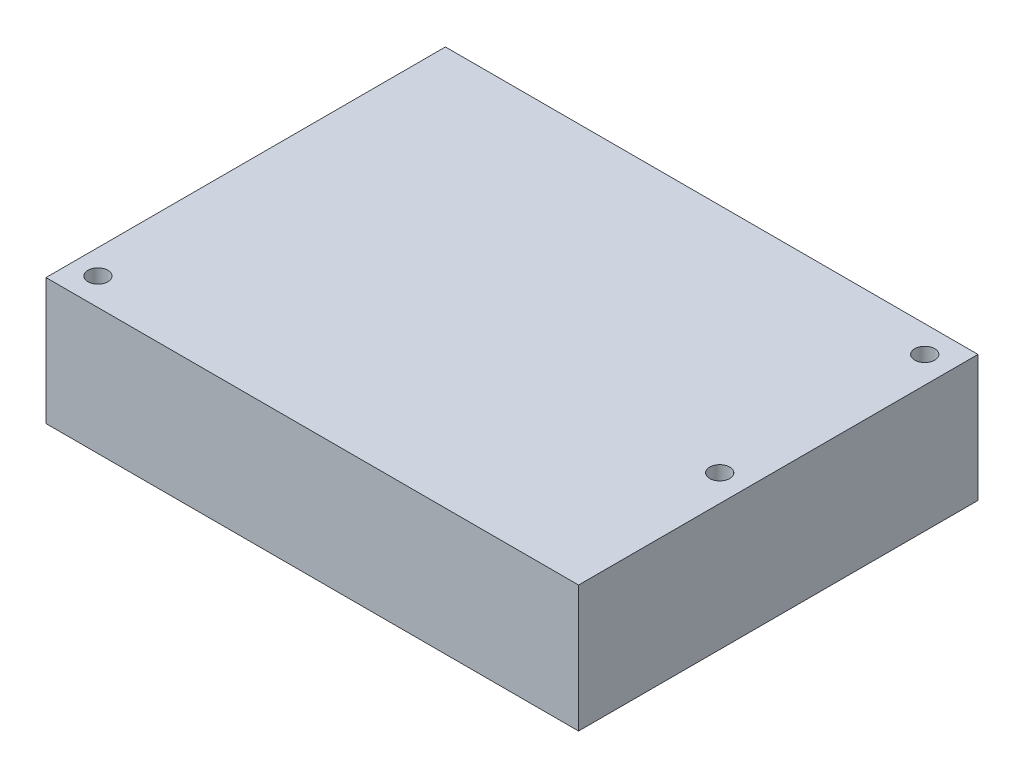
ISO-10303-21;
HEADER;
FILE_DESCRIPTION(('STEP AP214'),'2;1');
FILE_NAME('part.step','',(''),(''),'','','');
FILE_SCHEMA(('AUTOMOTIVE_DESIGN { 1 0 10303 214 1 1 1 1 }'));
ENDSEC;
DATA;
#1=APPLICATION_CONTEXT('core data for automotive mechanical design processes');
#2=APPLICATION_PROTOCOL_DEFINITION('international standard','automotive_design',2000,#1);
#3=PRODUCT_CONTEXT('',#1,'mechanical');
#4=PRODUCT('Part','Part','',(#3));
#5=PRODUCT_RELATED_PRODUCT_CATEGORY('part','',(#4));
#6=PRODUCT_DEFINITION_FORMATION('','',#4);
#7=PRODUCT_DEFINITION_CONTEXT('part definition',#1,'design');
#8=PRODUCT_DEFINITION('design','',#6,#7);
#9=PRODUCT_DEFINITION_SHAPE('','',#8);
#10=(LENGTH_UNIT() NAMED_UNIT(*) SI_UNIT(.MILLI.,.METRE.));
#11=(NAMED_UNIT(*) PLANE_ANGLE_UNIT() SI_UNIT($,.RADIAN.));
#12=(NAMED_UNIT(*) SI_UNIT($,.STERADIAN.) SOLID_ANGLE_UNIT());
#13=UNCERTAINTY_MEASURE_WITH_UNIT(LENGTH_MEASURE(1.E-05),#10,'distance_accuracy_value','');
#14=(GEOMETRIC_REPRESENTATION_CONTEXT(3) GLOBAL_UNCERTAINTY_ASSIGNED_CONTEXT((#13)) GLOBAL_UNIT_ASSIGNED_CONTEXT((#10,
#11,#12)) REPRESENTATION_CONTEXT('',''));
#15=CARTESIAN_POINT('',(0.,0.,0.));
#16=DIRECTION('',(0.,0.,1.));
#17=DIRECTION('',(1.,0.,0.));
#18=AXIS2_PLACEMENT_3D('',#15,#16,#17);
#19=CARTESIAN_POINT('',(0.,19.,0.));
#20=DIRECTION('',(0.,-1.,0.));
#21=DIRECTION('',(0.,0.,-1.));
#22=AXIS2_PLACEMENT_3D('',#19,#20,#21);
#23=PLANE('',#22);
#24=CARTESIAN_POINT('',(36.,19.,4.8));
#25=DIRECTION('',(0.,1.,0.));
#26=DIRECTION('',(0.,0.,1.));
#27=AXIS2_PLACEMENT_3D('',#24,#25,#26);
#28=CIRCLE('',#27,1.5);
#29=CARTESIAN_POINT('',(36.,19.,6.30000000000001));
#30=VERTEX_POINT('',#29);
#31=EDGE_CURVE('E115',#30,#30,#28,.T.);
#32=ORIENTED_EDGE('',*,*,#31,.F.);
#33=EDGE_LOOP('',(#32));
#34=FACE_BOUND('',#33,.T.);
#35=DIRECTION('',(0.,0.,-1.));
#36=VECTOR('',#35,1.);
#37=CARTESIAN_POINT('',(40.,19.,30.));
#38=LINE('',#37,#36);
#39=CARTESIAN_POINT('',(40.,19.,30.));
#40=VERTEX_POINT('',#39);
#41=CARTESIAN_POINT('',(40.,19.,-30.));
#42=VERTEX_POINT('',#41);
#43=EDGE_CURVE('E85',#40,#42,#38,.T.);
#44=ORIENTED_EDGE('',*,*,#43,.T.);
#45=DIRECTION('',(-1.,0.,0.));
#46=VECTOR('',#45,1.);
#47=CARTESIAN_POINT('',(-40.,19.,-30.));
#48=LINE('',#47,#46);
#49=CARTESIAN_POINT('',(-40.,19.,-30.));
#50=VERTEX_POINT('',#49);
#51=EDGE_CURVE('E80',#42,#50,#48,.T.);
#52=ORIENTED_EDGE('',*,*,#51,.T.);
#53=DIRECTION('',(0.,0.,1.));
#54=VECTOR('',#53,1.);
#55=CARTESIAN_POINT('',(-40.,19.,30.));
#56=LINE('',#55,#54);
#57=CARTESIAN_POINT('',(-40.,19.,30.));
#58=VERTEX_POINT('',#57);
#59=EDGE_CURVE('E83',#50,#58,#56,.T.);
#60=ORIENTED_EDGE('',*,*,#59,.T.);
#61=DIRECTION('',(1.,0.,0.));
#62=VECTOR('',#61,1.);
#63=CARTESIAN_POINT('',(-40.,19.,30.));
#64=LINE('',#63,#62);
#65=EDGE_CURVE('E50',#58,#40,#64,.T.);
#66=ORIENTED_EDGE('',*,*,#65,.T.);
#67=EDGE_LOOP('',(#44,#52,#60,#66));
#68=FACE_BOUND('',#67,.T.);
#69=CARTESIAN_POINT('',(36.,19.,-26.));
#70=DIRECTION('',(0.,1.,0.));
#71=DIRECTION('',(0.,0.,1.));
#72=AXIS2_PLACEMENT_3D('',#69,#70,#71);
#73=CIRCLE('',#72,1.5);
#74=CARTESIAN_POINT('',(36.,19.,-24.5));
#75=VERTEX_POINT('',#74);
#76=EDGE_CURVE('E100',#75,#75,#73,.T.);
#77=ORIENTED_EDGE('',*,*,#76,.F.);
#78=EDGE_LOOP('',(#77));
#79=FACE_BOUND('',#78,.T.);
#80=CARTESIAN_POINT('',(-36.3,19.,25.9));
#81=DIRECTION('',(0.,1.,0.));
#82=DIRECTION('',(0.,0.,1.));
#83=AXIS2_PLACEMENT_3D('',#80,#81,#82);
#84=CIRCLE('',#83,1.5);
#85=CARTESIAN_POINT('',(-36.3,19.,27.4));
#86=VERTEX_POINT('',#85);
#87=EDGE_CURVE('E121',#86,#86,#84,.T.);
#88=ORIENTED_EDGE('',*,*,#87,.F.);
#89=EDGE_LOOP('',(#88));
#90=FACE_BOUND('',#89,.T.);
#91=ADVANCED_FACE('F33',(#34,#68,#79,#90),#23,.F.);
#92=CARTESIAN_POINT('',(0.,0.,0.));
#93=DIRECTION('',(0.,-1.,0.));
#94=DIRECTION('',(0.,0.,-1.));
#95=AXIS2_PLACEMENT_3D('',#92,#93,#94);
#96=PLANE('',#95);
#97=CARTESIAN_POINT('',(36.,0.,4.8));
#98=DIRECTION('',(0.,1.,0.));
#99=DIRECTION('',(0.,0.,1.));
#100=AXIS2_PLACEMENT_3D('',#97,#98,#99);
#101=CIRCLE('',#100,1.5);
#102=CARTESIAN_POINT('',(36.,0.,6.30000000000001));
#103=VERTEX_POINT('',#102);
#104=EDGE_CURVE('E118',#103,#103,#101,.T.);
#105=ORIENTED_EDGE('',*,*,#104,.T.);
#106=EDGE_LOOP('',(#105));
#107=FACE_BOUND('',#106,.T.);
#108=DIRECTION('',(0.,0.,-1.));
#109=VECTOR('',#108,1.);
#110=CARTESIAN_POINT('',(40.,0.,30.));
#111=LINE('',#110,#109);
#112=CARTESIAN_POINT('',(40.,0.,30.));
#113=VERTEX_POINT('',#112);
#114=CARTESIAN_POINT('',(40.,0.,-30.));
#115=VERTEX_POINT('',#114);
#116=EDGE_CURVE('E97',#113,#115,#111,.T.);
#117=ORIENTED_EDGE('',*,*,#116,.F.);
#118=DIRECTION('',(1.,0.,0.));
#119=VECTOR('',#118,1.);
#120=CARTESIAN_POINT('',(-40.,0.,30.));
#121=LINE('',#120,#119);
#122=CARTESIAN_POINT('',(-40.,0.,30.));
#123=VERTEX_POINT('',#122);
#124=EDGE_CURVE('E73',#123,#113,#121,.T.);
#125=ORIENTED_EDGE('',*,*,#124,.F.);
#126=DIRECTION('',(0.,0.,1.));
#127=VECTOR('',#126,1.);
#128=CARTESIAN_POINT('',(-40.,0.,30.));
#129=LINE('',#128,#127);
#130=CARTESIAN_POINT('',(-40.,0.,-30.));
#131=VERTEX_POINT('',#130);
#132=EDGE_CURVE('E67',#131,#123,#129,.T.);
#133=ORIENTED_EDGE('',*,*,#132,.F.);
#134=DIRECTION('',(-1.,0.,0.));
#135=VECTOR('',#134,1.);
#136=CARTESIAN_POINT('',(-40.,0.,-30.));
#137=LINE('',#136,#135);
#138=EDGE_CURVE('E89',#115,#131,#137,.T.);
#139=ORIENTED_EDGE('',*,*,#138,.F.);
#140=EDGE_LOOP('',(#117,#125,#133,#139));
#141=FACE_BOUND('',#140,.T.);
#142=CARTESIAN_POINT('',(36.,0.,-26.));
#143=DIRECTION('',(0.,1.,0.));
#144=DIRECTION('',(0.,0.,1.));
#145=AXIS2_PLACEMENT_3D('',#142,#143,#144);
#146=CIRCLE('',#145,1.5);
#147=CARTESIAN_POINT('',(36.,0.,-24.5));
#148=VERTEX_POINT('',#147);
#149=EDGE_CURVE('E112',#148,#148,#146,.T.);
#150=ORIENTED_EDGE('',*,*,#149,.T.);
#151=EDGE_LOOP('',(#150));
#152=FACE_BOUND('',#151,.T.);
#153=CARTESIAN_POINT('',(-36.3,0.,25.9));
#154=DIRECTION('',(0.,1.,0.));
#155=DIRECTION('',(0.,0.,1.));
#156=AXIS2_PLACEMENT_3D('',#153,#154,#155);
#157=CIRCLE('',#156,1.5);
#158=CARTESIAN_POINT('',(-36.3,0.,27.4));
#159=VERTEX_POINT('',#158);
#160=EDGE_CURVE('E124',#159,#159,#157,.T.);
#161=ORIENTED_EDGE('',*,*,#160,.T.);
#162=EDGE_LOOP('',(#161));
#163=FACE_BOUND('',#162,.T.);
#164=ADVANCED_FACE('F108',(#107,#141,#152,#163),#96,.T.);
#165=CARTESIAN_POINT('',(40.,19.,30.));
#166=DIRECTION('',(-1.,0.,0.));
#167=DIRECTION('',(0.,0.,1.));
#168=AXIS2_PLACEMENT_3D('',#165,#166,#167);
#169=PLANE('',#168);
#170=ORIENTED_EDGE('',*,*,#116,.T.);
#171=DIRECTION('',(0.,-1.,0.));
#172=VECTOR('',#171,1.);
#173=CARTESIAN_POINT('',(40.,19.,-30.));
#174=LINE('',#173,#172);
#175=EDGE_CURVE('E11',#42,#115,#174,.T.);
#176=ORIENTED_EDGE('',*,*,#175,.F.);
#177=ORIENTED_EDGE('',*,*,#43,.F.);
#178=DIRECTION('',(0.,-1.,0.));
#179=VECTOR('',#178,1.);
#180=CARTESIAN_POINT('',(40.,19.,30.));
#181=LINE('',#180,#179);
#182=EDGE_CURVE('E93',#40,#113,#181,.T.);
#183=ORIENTED_EDGE('',*,*,#182,.T.);
#184=EDGE_LOOP('',(#170,#176,#177,#183));
#185=FACE_BOUND('',#184,.T.);
#186=ADVANCED_FACE('F35',(#185),#169,.F.);
#187=CARTESIAN_POINT('',(-40.,19.,-30.));
#188=DIRECTION('',(0.,0.,1.));
#189=DIRECTION('',(1.,0.,0.));
#190=AXIS2_PLACEMENT_3D('',#187,#188,#189);
#191=PLANE('',#190);
#192=ORIENTED_EDGE('',*,*,#138,.T.);
#193=DIRECTION('',(0.,-1.,0.));
#194=VECTOR('',#193,1.);
#195=CARTESIAN_POINT('',(-40.,19.,-30.));
#196=LINE('',#195,#194);
#197=EDGE_CURVE('E42',#50,#131,#196,.T.);
#198=ORIENTED_EDGE('',*,*,#197,.F.);
#199=ORIENTED_EDGE('',*,*,#51,.F.);
#200=ORIENTED_EDGE('',*,*,#175,.T.);
#201=EDGE_LOOP('',(#192,#198,#199,#200));
#202=FACE_BOUND('',#201,.T.);
#203=ADVANCED_FACE('F88',(#202),#191,.F.);
#204=CARTESIAN_POINT('',(-40.,19.,30.));
#205=DIRECTION('',(1.,0.,0.));
#206=DIRECTION('',(0.,0.,-1.));
#207=AXIS2_PLACEMENT_3D('',#204,#205,#206);
#208=PLANE('',#207);
#209=ORIENTED_EDGE('',*,*,#132,.T.);
#210=DIRECTION('',(0.,-1.,0.));
#211=VECTOR('',#210,1.);
#212=CARTESIAN_POINT('',(-40.,19.,30.));
#213=LINE('',#212,#211);
#214=EDGE_CURVE('E90',#58,#123,#213,.T.);
#215=ORIENTED_EDGE('',*,*,#214,.F.);
#216=ORIENTED_EDGE('',*,*,#59,.F.);
#217=ORIENTED_EDGE('',*,*,#197,.T.);
#218=EDGE_LOOP('',(#209,#215,#216,#217));
#219=FACE_BOUND('',#218,.T.);
#220=ADVANCED_FACE('F91',(#219),#208,.F.);
#221=CARTESIAN_POINT('',(-40.,19.,30.));
#222=DIRECTION('',(0.,0.,-1.));
#223=DIRECTION('',(-1.,0.,0.));
#224=AXIS2_PLACEMENT_3D('',#221,#222,#223);
#225=PLANE('',#224);
#226=ORIENTED_EDGE('',*,*,#124,.T.);
#227=ORIENTED_EDGE('',*,*,#182,.F.);
#228=ORIENTED_EDGE('',*,*,#65,.F.);
#229=ORIENTED_EDGE('',*,*,#214,.T.);
#230=EDGE_LOOP('',(#226,#227,#228,#229));
#231=FACE_BOUND('',#230,.T.);
#232=ADVANCED_FACE('F105',(#231),#225,.F.);
#233=CARTESIAN_POINT('',(36.,19.,-26.));
#234=DIRECTION('',(0.,-1.,0.));
#235=DIRECTION('',(0.,0.,-1.));
#236=AXIS2_PLACEMENT_3D('',#233,#234,#235);
#237=CYLINDRICAL_SURFACE('',#236,1.5);
#238=ORIENTED_EDGE('',*,*,#76,.T.);
#239=EDGE_LOOP('',(#238));
#240=FACE_BOUND('',#239,.T.);
#241=ORIENTED_EDGE('',*,*,#149,.F.);
#242=EDGE_LOOP('',(#241));
#243=FACE_BOUND('',#242,.T.);
#244=ADVANCED_FACE('F143',(#240,#243),#237,.F.);
#245=CARTESIAN_POINT('',(36.,19.,4.8));
#246=DIRECTION('',(0.,-1.,0.));
#247=DIRECTION('',(0.,0.,-1.));
#248=AXIS2_PLACEMENT_3D('',#245,#246,#247);
#249=CYLINDRICAL_SURFACE('',#248,1.5);
#250=ORIENTED_EDGE('',*,*,#31,.T.);
#251=EDGE_LOOP('',(#250));
#252=FACE_BOUND('',#251,.T.);
#253=ORIENTED_EDGE('',*,*,#104,.F.);
#254=EDGE_LOOP('',(#253));
#255=FACE_BOUND('',#254,.T.);
#256=ADVANCED_FACE('F189',(#252,#255),#249,.F.);
#257=CARTESIAN_POINT('',(-36.3,19.,25.9));
#258=DIRECTION('',(0.,-1.,0.));
#259=DIRECTION('',(0.,0.,-1.));
#260=AXIS2_PLACEMENT_3D('',#257,#258,#259);
#261=CYLINDRICAL_SURFACE('',#260,1.5);
#262=ORIENTED_EDGE('',*,*,#87,.T.);
#263=EDGE_LOOP('',(#262));
#264=FACE_BOUND('',#263,.T.);
#265=ORIENTED_EDGE('',*,*,#160,.F.);
#266=EDGE_LOOP('',(#265));
#267=FACE_BOUND('',#266,.T.);
#268=ADVANCED_FACE('F130',(#264,#267),#261,.F.);
#269=CLOSED_SHELL('',(#91,#164,#186,#203,#220,#232,#244,#256,#268));
#270=MANIFOLD_SOLID_BREP('B2',#269);
#271=ADVANCED_BREP_SHAPE_REPRESENTATION('',(#18,#270),#14);
#272=SHAPE_DEFINITION_REPRESENTATION(#9,#271);
ENDSEC;
END-ISO-10303-21;
